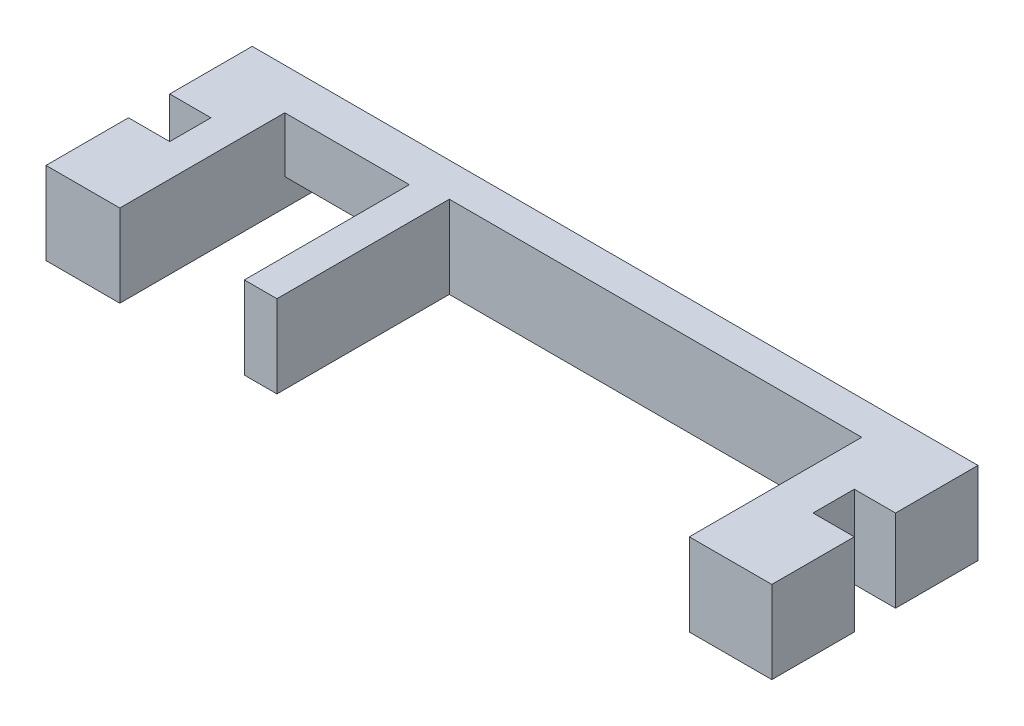
ISO-10303-21;
HEADER;
FILE_DESCRIPTION(('STEP AP214'),'2;1');
FILE_NAME('part.step','',(''),(''),'','','');
FILE_SCHEMA(('AUTOMOTIVE_DESIGN { 1 0 10303 214 1 1 1 1 }'));
ENDSEC;
DATA;
#1=APPLICATION_CONTEXT('core data for automotive mechanical design processes');
#2=APPLICATION_PROTOCOL_DEFINITION('international standard','automotive_design',2000,#1);
#3=PRODUCT_CONTEXT('',#1,'mechanical');
#4=PRODUCT('Part','Part','',(#3));
#5=PRODUCT_RELATED_PRODUCT_CATEGORY('part','',(#4));
#6=PRODUCT_DEFINITION_FORMATION('','',#4);
#7=PRODUCT_DEFINITION_CONTEXT('part definition',#1,'design');
#8=PRODUCT_DEFINITION('design','',#6,#7);
#9=PRODUCT_DEFINITION_SHAPE('','',#8);
#10=(LENGTH_UNIT() NAMED_UNIT(*) SI_UNIT(.MILLI.,.METRE.));
#11=(NAMED_UNIT(*) PLANE_ANGLE_UNIT() SI_UNIT($,.RADIAN.));
#12=(NAMED_UNIT(*) SI_UNIT($,.STERADIAN.) SOLID_ANGLE_UNIT());
#13=UNCERTAINTY_MEASURE_WITH_UNIT(LENGTH_MEASURE(1.E-05),#10,'distance_accuracy_value','');
#14=(GEOMETRIC_REPRESENTATION_CONTEXT(3) GLOBAL_UNCERTAINTY_ASSIGNED_CONTEXT((#13)) GLOBAL_UNIT_ASSIGNED_CONTEXT((#10,
#11,#12)) REPRESENTATION_CONTEXT('',''));
#15=CARTESIAN_POINT('',(0.,0.,0.));
#16=DIRECTION('',(0.,0.,1.));
#17=DIRECTION('',(1.,0.,0.));
#18=AXIS2_PLACEMENT_3D('',#15,#16,#17);
#19=CARTESIAN_POINT('',(0.,0.,0.));
#20=DIRECTION('',(0.,1.,0.));
#21=DIRECTION('',(0.,0.,1.));
#22=AXIS2_PLACEMENT_3D('',#19,#20,#21);
#23=PLANE('',#22);
#24=DIRECTION('',(0.,0.,1.));
#25=VECTOR('',#24,1.);
#26=CARTESIAN_POINT('',(-19.95,0.,0.));
#27=LINE('',#26,#25);
#28=CARTESIAN_POINT('',(-19.95,0.,-12.5));
#29=VERTEX_POINT('',#28);
#30=CARTESIAN_POINT('',(-19.95,0.,12.5));
#31=VERTEX_POINT('',#30);
#32=EDGE_CURVE('E48',#29,#31,#27,.T.);
#33=ORIENTED_EDGE('',*,*,#32,.F.);
#34=DIRECTION('',(-1.,0.,0.));
#35=VECTOR('',#34,1.);
#36=CARTESIAN_POINT('',(-49.,0.,-12.5));
#37=LINE('',#36,#35);
#38=CARTESIAN_POINT('',(44.,0.,-12.5));
#39=VERTEX_POINT('',#38);
#40=EDGE_CURVE('E326',#39,#29,#37,.T.);
#41=ORIENTED_EDGE('',*,*,#40,.F.);
#42=DIRECTION('',(0.,0.,-1.));
#43=VECTOR('',#42,1.);
#44=CARTESIAN_POINT('',(44.,0.,-12.5));
#45=LINE('',#44,#43);
#46=CARTESIAN_POINT('',(44.,0.,-2.5));
#47=VERTEX_POINT('',#46);
#48=EDGE_CURVE('E298',#47,#39,#45,.T.);
#49=ORIENTED_EDGE('',*,*,#48,.F.);
#50=DIRECTION('',(1.,0.,0.));
#51=VECTOR('',#50,1.);
#52=CARTESIAN_POINT('',(39.,0.,-2.5));
#53=LINE('',#52,#51);
#54=CARTESIAN_POINT('',(39.,0.,-2.5));
#55=VERTEX_POINT('',#54);
#56=EDGE_CURVE('E286',#55,#47,#53,.T.);
#57=ORIENTED_EDGE('',*,*,#56,.F.);
#58=DIRECTION('',(0.,0.,-1.));
#59=VECTOR('',#58,1.);
#60=CARTESIAN_POINT('',(39.,0.,-2.5));
#61=LINE('',#60,#59);
#62=CARTESIAN_POINT('',(39.,0.,2.5));
#63=VERTEX_POINT('',#62);
#64=EDGE_CURVE('E267',#63,#55,#61,.T.);
#65=ORIENTED_EDGE('',*,*,#64,.F.);
#66=DIRECTION('',(1.,0.,0.));
#67=VECTOR('',#66,1.);
#68=CARTESIAN_POINT('',(39.,0.,2.5));
#69=LINE('',#68,#67);
#70=CARTESIAN_POINT('',(44.,0.,2.5));
#71=VERTEX_POINT('',#70);
#72=EDGE_CURVE('E277',#63,#71,#69,.T.);
#73=ORIENTED_EDGE('',*,*,#72,.T.);
#74=CARTESIAN_POINT('',(44.,0.,12.5));
#75=VERTEX_POINT('',#74);
#76=EDGE_CURVE('E299',#75,#71,#45,.T.);
#77=ORIENTED_EDGE('',*,*,#76,.F.);
#78=DIRECTION('',(1.,0.,0.));
#79=VECTOR('',#78,1.);
#80=CARTESIAN_POINT('',(-49.,0.,12.5));
#81=LINE('',#80,#79);
#82=CARTESIAN_POINT('',(34.,0.,12.5));
#83=VERTEX_POINT('',#82);
#84=EDGE_CURVE('E329',#83,#75,#81,.T.);
#85=ORIENTED_EDGE('',*,*,#84,.F.);
#86=DIRECTION('',(0.,0.,-1.));
#87=VECTOR('',#86,1.);
#88=CARTESIAN_POINT('',(34.,0.,0.));
#89=LINE('',#88,#87);
#90=CARTESIAN_POINT('',(34.,0.,-8.40000000000005));
#91=VERTEX_POINT('',#90);
#92=EDGE_CURVE('E324',#83,#91,#89,.T.);
#93=ORIENTED_EDGE('',*,*,#92,.T.);
#94=DIRECTION('',(-1.,0.,0.));
#95=VECTOR('',#94,1.);
#96=CARTESIAN_POINT('',(0.,0.,-8.40000000000005));
#97=LINE('',#96,#95);
#98=CARTESIAN_POINT('',(-16.,0.,-8.40000000000005));
#99=VERTEX_POINT('',#98);
#100=EDGE_CURVE('E335',#91,#99,#97,.T.);
#101=ORIENTED_EDGE('',*,*,#100,.T.);
#102=DIRECTION('',(0.,0.,1.));
#103=VECTOR('',#102,1.);
#104=CARTESIAN_POINT('',(-16.,0.,0.));
#105=LINE('',#104,#103);
#106=CARTESIAN_POINT('',(-16.,0.,12.4999999999999));
#107=VERTEX_POINT('',#106);
#108=EDGE_CURVE('E338',#99,#107,#105,.T.);
#109=ORIENTED_EDGE('',*,*,#108,.T.);
#110=EDGE_CURVE('E332',#31,#107,#81,.T.);
#111=ORIENTED_EDGE('',*,*,#110,.F.);
#112=EDGE_LOOP('',(#33,#41,#49,#57,#65,#73,#77,#85,#93,#101,#109,#111));
#113=FACE_BOUND('',#112,.T.);
#114=ADVANCED_FACE('F40',(#113),#23,.F.);
#115=CARTESIAN_POINT('',(0.,-2.99999999999999,-7.5));
#116=DIRECTION('',(0.,0.,1.));
#117=DIRECTION('',(1.,0.,0.));
#118=AXIS2_PLACEMENT_3D('',#115,#116,#117);
#119=PLANE('',#118);
#120=DIRECTION('',(0.,1.,0.));
#121=VECTOR('',#120,1.);
#122=CARTESIAN_POINT('',(-35.05,-2.99999999999999,-7.5));
#123=LINE('',#122,#121);
#124=CARTESIAN_POINT('',(-35.05,3.3,-7.5));
#125=VERTEX_POINT('',#124);
#126=CARTESIAN_POINT('',(-35.05,10.,-7.5));
#127=VERTEX_POINT('',#126);
#128=EDGE_CURVE('E191',#125,#127,#123,.T.);
#129=ORIENTED_EDGE('',*,*,#128,.F.);
#130=DIRECTION('',(-1.,0.,0.));
#131=VECTOR('',#130,1.);
#132=CARTESIAN_POINT('',(-19.95,3.3,-7.5));
#133=LINE('',#132,#131);
#134=CARTESIAN_POINT('',(-19.95,3.3,-7.5));
#135=VERTEX_POINT('',#134);
#136=EDGE_CURVE('E198',#135,#125,#133,.T.);
#137=ORIENTED_EDGE('',*,*,#136,.F.);
#138=DIRECTION('',(0.,1.,0.));
#139=VECTOR('',#138,1.);
#140=CARTESIAN_POINT('',(-19.95,-2.99999999999999,-7.5));
#141=LINE('',#140,#139);
#142=CARTESIAN_POINT('',(-19.95,10.,-7.5));
#143=VERTEX_POINT('',#142);
#144=EDGE_CURVE('E212',#135,#143,#141,.T.);
#145=ORIENTED_EDGE('',*,*,#144,.T.);
#146=DIRECTION('',(1.,0.,0.));
#147=VECTOR('',#146,1.);
#148=CARTESIAN_POINT('',(0.,10.,-7.5));
#149=LINE('',#148,#147);
#150=EDGE_CURVE('E209',#127,#143,#149,.T.);
#151=ORIENTED_EDGE('',*,*,#150,.F.);
#152=EDGE_LOOP('',(#129,#137,#145,#151));
#153=FACE_BOUND('',#152,.T.);
#154=ADVANCED_FACE('F207',(#153),#119,.T.);
#155=CARTESIAN_POINT('',(-49.,10.,12.5));
#156=DIRECTION('',(0.,0.,-1.));
#157=DIRECTION('',(-1.,0.,0.));
#158=AXIS2_PLACEMENT_3D('',#155,#156,#157);
#159=PLANE('',#158);
#160=DIRECTION('',(0.,1.,0.));
#161=VECTOR('',#160,1.);
#162=CARTESIAN_POINT('',(-35.05,-2.99999999999999,12.5));
#163=LINE('',#162,#161);
#164=CARTESIAN_POINT('',(-35.05,0.,12.5));
#165=VERTEX_POINT('',#164);
#166=CARTESIAN_POINT('',(-35.05,10.,12.5));
#167=VERTEX_POINT('',#166);
#168=EDGE_CURVE('E222',#165,#167,#163,.T.);
#169=ORIENTED_EDGE('',*,*,#168,.T.);
#170=DIRECTION('',(1.,0.,0.));
#171=VECTOR('',#170,1.);
#172=CARTESIAN_POINT('',(-49.,10.,12.5));
#173=LINE('',#172,#171);
#174=CARTESIAN_POINT('',(-44.,10.,12.5));
#175=VERTEX_POINT('',#174);
#176=EDGE_CURVE('E321',#175,#167,#173,.T.);
#177=ORIENTED_EDGE('',*,*,#176,.F.);
#178=DIRECTION('',(0.,1.,0.));
#179=VECTOR('',#178,1.);
#180=CARTESIAN_POINT('',(-44.,0.,12.5));
#181=LINE('',#180,#179);
#182=CARTESIAN_POINT('',(-44.,0.,12.5));
#183=VERTEX_POINT('',#182);
#184=EDGE_CURVE('E309',#183,#175,#181,.T.);
#185=ORIENTED_EDGE('',*,*,#184,.F.);
#186=EDGE_CURVE('E320',#183,#165,#81,.T.);
#187=ORIENTED_EDGE('',*,*,#186,.T.);
#188=EDGE_LOOP('',(#169,#177,#185,#187));
#189=FACE_BOUND('',#188,.T.);
#190=ADVANCED_FACE('F402',(#189),#159,.F.);
#191=DIRECTION('',(0.,1.,0.));
#192=VECTOR('',#191,1.);
#193=CARTESIAN_POINT('',(-19.95,-2.99999999999999,12.5));
#194=LINE('',#193,#192);
#195=CARTESIAN_POINT('',(-19.95,10.,12.5));
#196=VERTEX_POINT('',#195);
#197=EDGE_CURVE('E216',#31,#196,#194,.T.);
#198=ORIENTED_EDGE('',*,*,#197,.F.);
#199=ORIENTED_EDGE('',*,*,#110,.T.);
#200=DIRECTION('',(0.,1.,0.));
#201=VECTOR('',#200,1.);
#202=CARTESIAN_POINT('',(-16.,-2.99999999999999,12.4999999999999));
#203=LINE('',#202,#201);
#204=CARTESIAN_POINT('',(-16.,10.,12.4999999999999));
#205=VERTEX_POINT('',#204);
#206=EDGE_CURVE('E231',#107,#205,#203,.T.);
#207=ORIENTED_EDGE('',*,*,#206,.T.);
#208=EDGE_CURVE('E325',#196,#205,#173,.T.);
#209=ORIENTED_EDGE('',*,*,#208,.F.);
#210=EDGE_LOOP('',(#198,#199,#207,#209));
#211=FACE_BOUND('',#210,.T.);
#212=ADVANCED_FACE('F353',(#211),#159,.F.);
#213=CARTESIAN_POINT('',(0.,10.,0.));
#214=DIRECTION('',(0.,1.,0.));
#215=DIRECTION('',(0.,0.,1.));
#216=AXIS2_PLACEMENT_3D('',#213,#214,#215);
#217=PLANE('',#216);
#218=ORIENTED_EDGE('',*,*,#176,.T.);
#219=DIRECTION('',(0.,0.,-1.));
#220=VECTOR('',#219,1.);
#221=CARTESIAN_POINT('',(-35.05,10.,0.));
#222=LINE('',#221,#220);
#223=EDGE_CURVE('E456',#167,#127,#222,.T.);
#224=ORIENTED_EDGE('',*,*,#223,.T.);
#225=ORIENTED_EDGE('',*,*,#150,.T.);
#226=DIRECTION('',(0.,0.,1.));
#227=VECTOR('',#226,1.);
#228=CARTESIAN_POINT('',(-19.95,10.,0.));
#229=LINE('',#228,#227);
#230=EDGE_CURVE('E380',#143,#196,#229,.T.);
#231=ORIENTED_EDGE('',*,*,#230,.T.);
#232=ORIENTED_EDGE('',*,*,#208,.T.);
#233=DIRECTION('',(0.,0.,1.));
#234=VECTOR('',#233,1.);
#235=CARTESIAN_POINT('',(-16.,10.,12.4999999999999));
#236=LINE('',#235,#234);
#237=CARTESIAN_POINT('',(-16.,10.,-8.40000000000005));
#238=VERTEX_POINT('',#237);
#239=EDGE_CURVE('E227',#238,#205,#236,.T.);
#240=ORIENTED_EDGE('',*,*,#239,.F.);
#241=DIRECTION('',(-1.,0.,0.));
#242=VECTOR('',#241,1.);
#243=CARTESIAN_POINT('',(-16.,10.,-8.40000000000005));
#244=LINE('',#243,#242);
#245=CARTESIAN_POINT('',(34.,10.,-8.40000000000005));
#246=VERTEX_POINT('',#245);
#247=EDGE_CURVE('E214',#246,#238,#244,.T.);
#248=ORIENTED_EDGE('',*,*,#247,.F.);
#249=DIRECTION('',(0.,0.,-1.));
#250=VECTOR('',#249,1.);
#251=CARTESIAN_POINT('',(34.,10.,-8.40000000000005));
#252=LINE('',#251,#250);
#253=CARTESIAN_POINT('',(34.,10.,12.5));
#254=VERTEX_POINT('',#253);
#255=EDGE_CURVE('E211',#254,#246,#252,.T.);
#256=ORIENTED_EDGE('',*,*,#255,.F.);
#257=CARTESIAN_POINT('',(44.,10.,12.5));
#258=VERTEX_POINT('',#257);
#259=EDGE_CURVE('E319',#254,#258,#173,.T.);
#260=ORIENTED_EDGE('',*,*,#259,.T.);
#261=DIRECTION('',(0.,0.,1.));
#262=VECTOR('',#261,1.);
#263=CARTESIAN_POINT('',(44.,10.,-12.5));
#264=LINE('',#263,#262);
#265=CARTESIAN_POINT('',(44.,10.,2.5));
#266=VERTEX_POINT('',#265);
#267=EDGE_CURVE('E291',#266,#258,#264,.T.);
#268=ORIENTED_EDGE('',*,*,#267,.F.);
#269=DIRECTION('',(1.,0.,0.));
#270=VECTOR('',#269,1.);
#271=CARTESIAN_POINT('',(39.,10.,2.5));
#272=LINE('',#271,#270);
#273=CARTESIAN_POINT('',(39.,10.,2.5));
#274=VERTEX_POINT('',#273);
#275=EDGE_CURVE('E280',#274,#266,#272,.T.);
#276=ORIENTED_EDGE('',*,*,#275,.F.);
#277=DIRECTION('',(0.,0.,1.));
#278=VECTOR('',#277,1.);
#279=CARTESIAN_POINT('',(39.,10.,2.5));
#280=LINE('',#279,#278);
#281=CARTESIAN_POINT('',(39.,10.,-2.5));
#282=VERTEX_POINT('',#281);
#283=EDGE_CURVE('E274',#282,#274,#280,.T.);
#284=ORIENTED_EDGE('',*,*,#283,.F.);
#285=DIRECTION('',(1.,0.,0.));
#286=VECTOR('',#285,1.);
#287=CARTESIAN_POINT('',(39.,10.,-2.5));
#288=LINE('',#287,#286);
#289=CARTESIAN_POINT('',(44.,10.,-2.5));
#290=VERTEX_POINT('',#289);
#291=EDGE_CURVE('E283',#282,#290,#288,.T.);
#292=ORIENTED_EDGE('',*,*,#291,.T.);
#293=CARTESIAN_POINT('',(44.,10.,-12.5));
#294=VERTEX_POINT('',#293);
#295=EDGE_CURVE('E292',#294,#290,#264,.T.);
#296=ORIENTED_EDGE('',*,*,#295,.F.);
#297=DIRECTION('',(-1.,0.,0.));
#298=VECTOR('',#297,1.);
#299=CARTESIAN_POINT('',(-49.,10.,-12.5));
#300=LINE('',#299,#298);
#301=CARTESIAN_POINT('',(-44.,10.,-12.5));
#302=VERTEX_POINT('',#301);
#303=EDGE_CURVE('E316',#294,#302,#300,.T.);
#304=ORIENTED_EDGE('',*,*,#303,.T.);
#305=DIRECTION('',(0.,0.,-1.));
#306=VECTOR('',#305,1.);
#307=CARTESIAN_POINT('',(-44.,10.,-12.5));
#308=LINE('',#307,#306);
#309=CARTESIAN_POINT('',(-44.,10.,-2.5));
#310=VERTEX_POINT('',#309);
#311=EDGE_CURVE('E311',#310,#302,#308,.T.);
#312=ORIENTED_EDGE('',*,*,#311,.F.);
#313=DIRECTION('',(-1.,0.,0.));
#314=VECTOR('',#313,1.);
#315=CARTESIAN_POINT('',(-39.,10.,-2.5));
#316=LINE('',#315,#314);
#317=CARTESIAN_POINT('',(-39.,10.,-2.5));
#318=VERTEX_POINT('',#317);
#319=EDGE_CURVE('E255',#318,#310,#316,.T.);
#320=ORIENTED_EDGE('',*,*,#319,.F.);
#321=DIRECTION('',(0.,0.,-1.));
#322=VECTOR('',#321,1.);
#323=CARTESIAN_POINT('',(-39.,10.,-2.5));
#324=LINE('',#323,#322);
#325=CARTESIAN_POINT('',(-39.,10.,2.5));
#326=VERTEX_POINT('',#325);
#327=EDGE_CURVE('E249',#326,#318,#324,.T.);
#328=ORIENTED_EDGE('',*,*,#327,.F.);
#329=DIRECTION('',(-1.,0.,0.));
#330=VECTOR('',#329,1.);
#331=CARTESIAN_POINT('',(-39.,10.,2.5));
#332=LINE('',#331,#330);
#333=CARTESIAN_POINT('',(-44.,10.,2.5));
#334=VERTEX_POINT('',#333);
#335=EDGE_CURVE('E258',#326,#334,#332,.T.);
#336=ORIENTED_EDGE('',*,*,#335,.T.);
#337=EDGE_CURVE('E312',#175,#334,#308,.T.);
#338=ORIENTED_EDGE('',*,*,#337,.F.);
#339=EDGE_LOOP('',(#218,#224,#225,#231,#232,#240,#248,#256,#260,#268,#276,#284,#292,#296,#304,
#312,#320,#328,#336,#338));
#340=FACE_BOUND('',#339,.T.);
#341=ADVANCED_FACE('F376',(#340),#217,.T.);
#342=CARTESIAN_POINT('',(-35.05,0.,-12.5));
#343=VERTEX_POINT('',#342);
#344=CARTESIAN_POINT('',(-44.,0.,-12.5));
#345=VERTEX_POINT('',#344);
#346=EDGE_CURVE('E315',#343,#345,#37,.T.);
#347=ORIENTED_EDGE('',*,*,#346,.F.);
#348=DIRECTION('',(0.,0.,-1.));
#349=VECTOR('',#348,1.);
#350=CARTESIAN_POINT('',(-35.05,0.,0.));
#351=LINE('',#350,#349);
#352=EDGE_CURVE('E11',#165,#343,#351,.T.);
#353=ORIENTED_EDGE('',*,*,#352,.F.);
#354=ORIENTED_EDGE('',*,*,#186,.F.);
#355=DIRECTION('',(0.,0.,1.));
#356=VECTOR('',#355,1.);
#357=CARTESIAN_POINT('',(-44.,0.,-12.5));
#358=LINE('',#357,#356);
#359=CARTESIAN_POINT('',(-44.,0.,2.5));
#360=VERTEX_POINT('',#359);
#361=EDGE_CURVE('E305',#360,#183,#358,.T.);
#362=ORIENTED_EDGE('',*,*,#361,.F.);
#363=DIRECTION('',(-1.,0.,0.));
#364=VECTOR('',#363,1.);
#365=CARTESIAN_POINT('',(-39.,0.,2.5));
#366=LINE('',#365,#364);
#367=CARTESIAN_POINT('',(-39.,0.,2.5));
#368=VERTEX_POINT('',#367);
#369=EDGE_CURVE('E63',#368,#360,#366,.T.);
#370=ORIENTED_EDGE('',*,*,#369,.F.);
#371=DIRECTION('',(0.,0.,1.));
#372=VECTOR('',#371,1.);
#373=CARTESIAN_POINT('',(-39.,0.,-2.5));
#374=LINE('',#373,#372);
#375=CARTESIAN_POINT('',(-39.,0.,-2.5));
#376=VERTEX_POINT('',#375);
#377=EDGE_CURVE('E242',#376,#368,#374,.T.);
#378=ORIENTED_EDGE('',*,*,#377,.F.);
#379=DIRECTION('',(-1.,0.,0.));
#380=VECTOR('',#379,1.);
#381=CARTESIAN_POINT('',(-39.,0.,-2.5));
#382=LINE('',#381,#380);
#383=CARTESIAN_POINT('',(-44.,0.,-2.5));
#384=VERTEX_POINT('',#383);
#385=EDGE_CURVE('E252',#376,#384,#382,.T.);
#386=ORIENTED_EDGE('',*,*,#385,.T.);
#387=EDGE_CURVE('E306',#345,#384,#358,.T.);
#388=ORIENTED_EDGE('',*,*,#387,.F.);
#389=EDGE_LOOP('',(#347,#353,#354,#362,#370,#378,#386,#388));
#390=FACE_BOUND('',#389,.T.);
#391=ADVANCED_FACE('F398',(#390),#23,.F.);
#392=CARTESIAN_POINT('',(-44.,0.,0.));
#393=DIRECTION('',(1.,0.,0.));
#394=DIRECTION('',(0.,0.,-1.));
#395=AXIS2_PLACEMENT_3D('',#392,#393,#394);
#396=PLANE('',#395);
#397=ORIENTED_EDGE('',*,*,#387,.T.);
#398=DIRECTION('',(0.,-1.,0.));
#399=VECTOR('',#398,1.);
#400=CARTESIAN_POINT('',(-44.,0.,-2.5));
#401=LINE('',#400,#399);
#402=EDGE_CURVE('E234',#310,#384,#401,.T.);
#403=ORIENTED_EDGE('',*,*,#402,.F.);
#404=ORIENTED_EDGE('',*,*,#311,.T.);
#405=DIRECTION('',(0.,-1.,0.));
#406=VECTOR('',#405,1.);
#407=CARTESIAN_POINT('',(-44.,0.,-12.5));
#408=LINE('',#407,#406);
#409=EDGE_CURVE('E302',#302,#345,#408,.T.);
#410=ORIENTED_EDGE('',*,*,#409,.T.);
#411=EDGE_LOOP('',(#397,#403,#404,#410));
#412=FACE_BOUND('',#411,.T.);
#413=ADVANCED_FACE('F406',(#412),#396,.F.);
#414=CARTESIAN_POINT('',(44.,0.,0.));
#415=DIRECTION('',(-1.,0.,0.));
#416=DIRECTION('',(0.,0.,1.));
#417=AXIS2_PLACEMENT_3D('',#414,#415,#416);
#418=PLANE('',#417);
#419=ORIENTED_EDGE('',*,*,#76,.T.);
#420=DIRECTION('',(0.,-1.,0.));
#421=VECTOR('',#420,1.);
#422=CARTESIAN_POINT('',(44.,10.,2.5));
#423=LINE('',#422,#421);
#424=EDGE_CURVE('E257',#266,#71,#423,.T.);
#425=ORIENTED_EDGE('',*,*,#424,.F.);
#426=ORIENTED_EDGE('',*,*,#267,.T.);
#427=DIRECTION('',(0.,-1.,0.));
#428=VECTOR('',#427,1.);
#429=CARTESIAN_POINT('',(44.,10.,12.5));
#430=LINE('',#429,#428);
#431=EDGE_CURVE('E295',#258,#75,#430,.T.);
#432=ORIENTED_EDGE('',*,*,#431,.T.);
#433=EDGE_LOOP('',(#419,#425,#426,#432));
#434=FACE_BOUND('',#433,.T.);
#435=ADVANCED_FACE('F364',(#434),#418,.F.);
#436=CARTESIAN_POINT('',(-49.,10.,-12.5));
#437=DIRECTION('',(0.,0.,1.));
#438=DIRECTION('',(1.,0.,0.));
#439=AXIS2_PLACEMENT_3D('',#436,#437,#438);
#440=PLANE('',#439);
#441=ORIENTED_EDGE('',*,*,#40,.T.);
#442=DIRECTION('',(0.,-1.,0.));
#443=VECTOR('',#442,1.);
#444=CARTESIAN_POINT('',(-19.95,3.3,-12.5));
#445=LINE('',#444,#443);
#446=CARTESIAN_POINT('',(-19.95,3.3,-12.5));
#447=VERTEX_POINT('',#446);
#448=EDGE_CURVE('E347',#447,#29,#445,.T.);
#449=ORIENTED_EDGE('',*,*,#448,.F.);
#450=DIRECTION('',(1.,0.,0.));
#451=VECTOR('',#450,1.);
#452=CARTESIAN_POINT('',(-35.05,3.3,-12.5));
#453=LINE('',#452,#451);
#454=CARTESIAN_POINT('',(-35.05,3.3,-12.5));
#455=VERTEX_POINT('',#454);
#456=EDGE_CURVE('E197',#455,#447,#453,.T.);
#457=ORIENTED_EDGE('',*,*,#456,.F.);
#458=DIRECTION('',(0.,-1.,0.));
#459=VECTOR('',#458,1.);
#460=CARTESIAN_POINT('',(-35.05,3.3,-12.5));
#461=LINE('',#460,#459);
#462=EDGE_CURVE('E194',#455,#343,#461,.T.);
#463=ORIENTED_EDGE('',*,*,#462,.T.);
#464=ORIENTED_EDGE('',*,*,#346,.T.);
#465=ORIENTED_EDGE('',*,*,#409,.F.);
#466=ORIENTED_EDGE('',*,*,#303,.F.);
#467=DIRECTION('',(0.,1.,0.));
#468=VECTOR('',#467,1.);
#469=CARTESIAN_POINT('',(44.,10.,-12.5));
#470=LINE('',#469,#468);
#471=EDGE_CURVE('E282',#39,#294,#470,.T.);
#472=ORIENTED_EDGE('',*,*,#471,.F.);
#473=EDGE_LOOP('',(#441,#449,#457,#463,#464,#465,#466,#472));
#474=FACE_BOUND('',#473,.T.);
#475=ADVANCED_FACE('F42',(#474),#440,.F.);
#476=ORIENTED_EDGE('',*,*,#259,.F.);
#477=DIRECTION('',(0.,1.,0.));
#478=VECTOR('',#477,1.);
#479=CARTESIAN_POINT('',(34.,-2.99999999999999,12.5));
#480=LINE('',#479,#478);
#481=EDGE_CURVE('E230',#83,#254,#480,.T.);
#482=ORIENTED_EDGE('',*,*,#481,.F.);
#483=ORIENTED_EDGE('',*,*,#84,.T.);
#484=ORIENTED_EDGE('',*,*,#431,.F.);
#485=EDGE_LOOP('',(#476,#482,#483,#484));
#486=FACE_BOUND('',#485,.T.);
#487=ADVANCED_FACE('F360',(#486),#159,.F.);
#488=ORIENTED_EDGE('',*,*,#337,.T.);
#489=DIRECTION('',(0.,1.,0.));
#490=VECTOR('',#489,1.);
#491=CARTESIAN_POINT('',(-44.,0.,2.5));
#492=LINE('',#491,#490);
#493=EDGE_CURVE('E243',#360,#334,#492,.T.);
#494=ORIENTED_EDGE('',*,*,#493,.F.);
#495=ORIENTED_EDGE('',*,*,#361,.T.);
#496=ORIENTED_EDGE('',*,*,#184,.T.);
#497=EDGE_LOOP('',(#488,#494,#495,#496));
#498=FACE_BOUND('',#497,.T.);
#499=ADVANCED_FACE('F414',(#498),#396,.F.);
#500=ORIENTED_EDGE('',*,*,#295,.T.);
#501=DIRECTION('',(0.,1.,0.));
#502=VECTOR('',#501,1.);
#503=CARTESIAN_POINT('',(44.,10.,-2.5));
#504=LINE('',#503,#502);
#505=EDGE_CURVE('E268',#47,#290,#504,.T.);
#506=ORIENTED_EDGE('',*,*,#505,.F.);
#507=ORIENTED_EDGE('',*,*,#48,.T.);
#508=ORIENTED_EDGE('',*,*,#471,.T.);
#509=EDGE_LOOP('',(#500,#506,#507,#508));
#510=FACE_BOUND('',#509,.T.);
#511=ADVANCED_FACE('F430',(#510),#418,.F.);
#512=CARTESIAN_POINT('',(39.,10.,2.5));
#513=DIRECTION('',(0.,0.,1.));
#514=DIRECTION('',(0.,-1.,0.));
#515=AXIS2_PLACEMENT_3D('',#512,#513,#514);
#516=PLANE('',#515);
#517=ORIENTED_EDGE('',*,*,#424,.T.);
#518=ORIENTED_EDGE('',*,*,#72,.F.);
#519=DIRECTION('',(0.,-1.,0.));
#520=VECTOR('',#519,1.);
#521=CARTESIAN_POINT('',(39.,10.,2.5));
#522=LINE('',#521,#520);
#523=EDGE_CURVE('E264',#274,#63,#522,.T.);
#524=ORIENTED_EDGE('',*,*,#523,.F.);
#525=ORIENTED_EDGE('',*,*,#275,.T.);
#526=EDGE_LOOP('',(#517,#518,#524,#525));
#527=FACE_BOUND('',#526,.T.);
#528=ADVANCED_FACE('F370',(#527),#516,.F.);
#529=CARTESIAN_POINT('',(39.,10.,-2.5));
#530=DIRECTION('',(0.,0.,-1.));
#531=DIRECTION('',(0.,1.,0.));
#532=AXIS2_PLACEMENT_3D('',#529,#530,#531);
#533=PLANE('',#532);
#534=ORIENTED_EDGE('',*,*,#505,.T.);
#535=ORIENTED_EDGE('',*,*,#291,.F.);
#536=DIRECTION('',(0.,1.,0.));
#537=VECTOR('',#536,1.);
#538=CARTESIAN_POINT('',(39.,10.,-2.5));
#539=LINE('',#538,#537);
#540=EDGE_CURVE('E271',#55,#282,#539,.T.);
#541=ORIENTED_EDGE('',*,*,#540,.F.);
#542=ORIENTED_EDGE('',*,*,#56,.T.);
#543=EDGE_LOOP('',(#534,#535,#541,#542));
#544=FACE_BOUND('',#543,.T.);
#545=ADVANCED_FACE('F432',(#544),#533,.F.);
#546=CARTESIAN_POINT('',(39.,0.,0.));
#547=DIRECTION('',(-1.,0.,0.));
#548=DIRECTION('',(0.,0.,1.));
#549=AXIS2_PLACEMENT_3D('',#546,#547,#548);
#550=PLANE('',#549);
#551=ORIENTED_EDGE('',*,*,#523,.T.);
#552=ORIENTED_EDGE('',*,*,#64,.T.);
#553=ORIENTED_EDGE('',*,*,#540,.T.);
#554=ORIENTED_EDGE('',*,*,#283,.T.);
#555=EDGE_LOOP('',(#551,#552,#553,#554));
#556=FACE_BOUND('',#555,.T.);
#557=ADVANCED_FACE('F372',(#556),#550,.F.);
#558=CARTESIAN_POINT('',(-39.,0.,-2.5));
#559=DIRECTION('',(0.,0.,-1.));
#560=DIRECTION('',(-1.,0.,0.));
#561=AXIS2_PLACEMENT_3D('',#558,#559,#560);
#562=PLANE('',#561);
#563=ORIENTED_EDGE('',*,*,#402,.T.);
#564=ORIENTED_EDGE('',*,*,#385,.F.);
#565=DIRECTION('',(0.,-1.,0.));
#566=VECTOR('',#565,1.);
#567=CARTESIAN_POINT('',(-39.,0.,-2.5));
#568=LINE('',#567,#566);
#569=EDGE_CURVE('E239',#318,#376,#568,.T.);
#570=ORIENTED_EDGE('',*,*,#569,.F.);
#571=ORIENTED_EDGE('',*,*,#319,.T.);
#572=EDGE_LOOP('',(#563,#564,#570,#571));
#573=FACE_BOUND('',#572,.T.);
#574=ADVANCED_FACE('F439',(#573),#562,.F.);
#575=CARTESIAN_POINT('',(-39.,0.,2.5));
#576=DIRECTION('',(0.,0.,1.));
#577=DIRECTION('',(1.,0.,0.));
#578=AXIS2_PLACEMENT_3D('',#575,#576,#577);
#579=PLANE('',#578);
#580=ORIENTED_EDGE('',*,*,#493,.T.);
#581=ORIENTED_EDGE('',*,*,#335,.F.);
#582=DIRECTION('',(0.,1.,0.));
#583=VECTOR('',#582,1.);
#584=CARTESIAN_POINT('',(-39.,0.,2.5));
#585=LINE('',#584,#583);
#586=EDGE_CURVE('E246',#368,#326,#585,.T.);
#587=ORIENTED_EDGE('',*,*,#586,.F.);
#588=ORIENTED_EDGE('',*,*,#369,.T.);
#589=EDGE_LOOP('',(#580,#581,#587,#588));
#590=FACE_BOUND('',#589,.T.);
#591=ADVANCED_FACE('F467',(#590),#579,.F.);
#592=CARTESIAN_POINT('',(-39.,0.,0.));
#593=DIRECTION('',(1.,0.,0.));
#594=DIRECTION('',(0.,0.,-1.));
#595=AXIS2_PLACEMENT_3D('',#592,#593,#594);
#596=PLANE('',#595);
#597=ORIENTED_EDGE('',*,*,#569,.T.);
#598=ORIENTED_EDGE('',*,*,#377,.T.);
#599=ORIENTED_EDGE('',*,*,#586,.T.);
#600=ORIENTED_EDGE('',*,*,#327,.T.);
#601=EDGE_LOOP('',(#597,#598,#599,#600));
#602=FACE_BOUND('',#601,.T.);
#603=ADVANCED_FACE('F464',(#602),#596,.F.);
#604=CARTESIAN_POINT('',(-16.,-2.99999999999999,12.4999999999999));
#605=DIRECTION('',(-1.,0.,0.));
#606=DIRECTION('',(0.,0.,1.));
#607=AXIS2_PLACEMENT_3D('',#604,#605,#606);
#608=PLANE('',#607);
#609=DIRECTION('',(0.,1.,0.));
#610=VECTOR('',#609,1.);
#611=CARTESIAN_POINT('',(-16.,-2.99999999999999,-8.40000000000005));
#612=LINE('',#611,#610);
#613=EDGE_CURVE('E235',#99,#238,#612,.T.);
#614=ORIENTED_EDGE('',*,*,#613,.T.);
#615=ORIENTED_EDGE('',*,*,#239,.T.);
#616=ORIENTED_EDGE('',*,*,#206,.F.);
#617=ORIENTED_EDGE('',*,*,#108,.F.);
#618=EDGE_LOOP('',(#614,#615,#616,#617));
#619=FACE_BOUND('',#618,.T.);
#620=ADVANCED_FACE('F382',(#619),#608,.F.);
#621=CARTESIAN_POINT('',(-16.,-2.99999999999999,-8.40000000000005));
#622=DIRECTION('',(0.,0.,-1.));
#623=DIRECTION('',(-1.,0.,0.));
#624=AXIS2_PLACEMENT_3D('',#621,#622,#623);
#625=PLANE('',#624);
#626=DIRECTION('',(0.,1.,0.));
#627=VECTOR('',#626,1.);
#628=CARTESIAN_POINT('',(34.,-2.99999999999999,-8.40000000000005));
#629=LINE('',#628,#627);
#630=EDGE_CURVE('E55',#91,#246,#629,.T.);
#631=ORIENTED_EDGE('',*,*,#630,.T.);
#632=ORIENTED_EDGE('',*,*,#247,.T.);
#633=ORIENTED_EDGE('',*,*,#613,.F.);
#634=ORIENTED_EDGE('',*,*,#100,.F.);
#635=EDGE_LOOP('',(#631,#632,#633,#634));
#636=FACE_BOUND('',#635,.T.);
#637=ADVANCED_FACE('F385',(#636),#625,.F.);
#638=CARTESIAN_POINT('',(34.,-2.99999999999999,-8.40000000000005));
#639=DIRECTION('',(1.,0.,0.));
#640=DIRECTION('',(0.,0.,-1.));
#641=AXIS2_PLACEMENT_3D('',#638,#639,#640);
#642=PLANE('',#641);
#643=ORIENTED_EDGE('',*,*,#481,.T.);
#644=ORIENTED_EDGE('',*,*,#255,.T.);
#645=ORIENTED_EDGE('',*,*,#630,.F.);
#646=ORIENTED_EDGE('',*,*,#92,.F.);
#647=EDGE_LOOP('',(#643,#644,#645,#646));
#648=FACE_BOUND('',#647,.T.);
#649=ADVANCED_FACE('F386',(#648),#642,.F.);
#650=CARTESIAN_POINT('',(-35.05,-2.99999999999999,0.));
#651=DIRECTION('',(1.,0.,0.));
#652=DIRECTION('',(0.,0.,-1.));
#653=AXIS2_PLACEMENT_3D('',#650,#651,#652);
#654=PLANE('',#653);
#655=ORIENTED_EDGE('',*,*,#352,.T.);
#656=ORIENTED_EDGE('',*,*,#462,.F.);
#657=DIRECTION('',(0.,0.,-1.));
#658=VECTOR('',#657,1.);
#659=CARTESIAN_POINT('',(-35.05,3.3,-7.5));
#660=LINE('',#659,#658);
#661=EDGE_CURVE('E187',#125,#455,#660,.T.);
#662=ORIENTED_EDGE('',*,*,#661,.F.);
#663=ORIENTED_EDGE('',*,*,#128,.T.);
#664=ORIENTED_EDGE('',*,*,#223,.F.);
#665=ORIENTED_EDGE('',*,*,#168,.F.);
#666=EDGE_LOOP('',(#655,#656,#662,#663,#664,#665));
#667=FACE_BOUND('',#666,.T.);
#668=ADVANCED_FACE('F189',(#667),#654,.T.);
#669=CARTESIAN_POINT('',(-19.95,-2.99999999999999,0.));
#670=DIRECTION('',(-1.,0.,0.));
#671=DIRECTION('',(0.,0.,1.));
#672=AXIS2_PLACEMENT_3D('',#669,#670,#671);
#673=PLANE('',#672);
#674=ORIENTED_EDGE('',*,*,#32,.T.);
#675=ORIENTED_EDGE('',*,*,#197,.T.);
#676=ORIENTED_EDGE('',*,*,#230,.F.);
#677=ORIENTED_EDGE('',*,*,#144,.F.);
#678=DIRECTION('',(0.,0.,1.));
#679=VECTOR('',#678,1.);
#680=CARTESIAN_POINT('',(-19.95,3.3,-7.5));
#681=LINE('',#680,#679);
#682=EDGE_CURVE('E203',#447,#135,#681,.T.);
#683=ORIENTED_EDGE('',*,*,#682,.F.);
#684=ORIENTED_EDGE('',*,*,#448,.T.);
#685=EDGE_LOOP('',(#674,#675,#676,#677,#683,#684));
#686=FACE_BOUND('',#685,.T.);
#687=ADVANCED_FACE('F343',(#686),#673,.T.);
#688=CARTESIAN_POINT('',(0.,3.3,0.));
#689=DIRECTION('',(0.,-1.,0.));
#690=DIRECTION('',(0.,0.,-1.));
#691=AXIS2_PLACEMENT_3D('',#688,#689,#690);
#692=PLANE('',#691);
#693=ORIENTED_EDGE('',*,*,#136,.T.);
#694=ORIENTED_EDGE('',*,*,#661,.T.);
#695=ORIENTED_EDGE('',*,*,#456,.T.);
#696=ORIENTED_EDGE('',*,*,#682,.T.);
#697=EDGE_LOOP('',(#693,#694,#695,#696));
#698=FACE_BOUND('',#697,.T.);
#699=ADVANCED_FACE('F201',(#698),#692,.T.);
#700=CLOSED_SHELL('',(#114,#154,#190,#212,#341,#391,#413,#435,#475,#487,#499,#511,#528,#545,
#557,#574,#591,#603,#620,#637,#649,#668,#687,#699));
#701=MANIFOLD_SOLID_BREP('B2',#700);
#702=ADVANCED_BREP_SHAPE_REPRESENTATION('',(#18,#701),#14);
#703=SHAPE_DEFINITION_REPRESENTATION(#9,#702);
ENDSEC;
END-ISO-10303-21;
